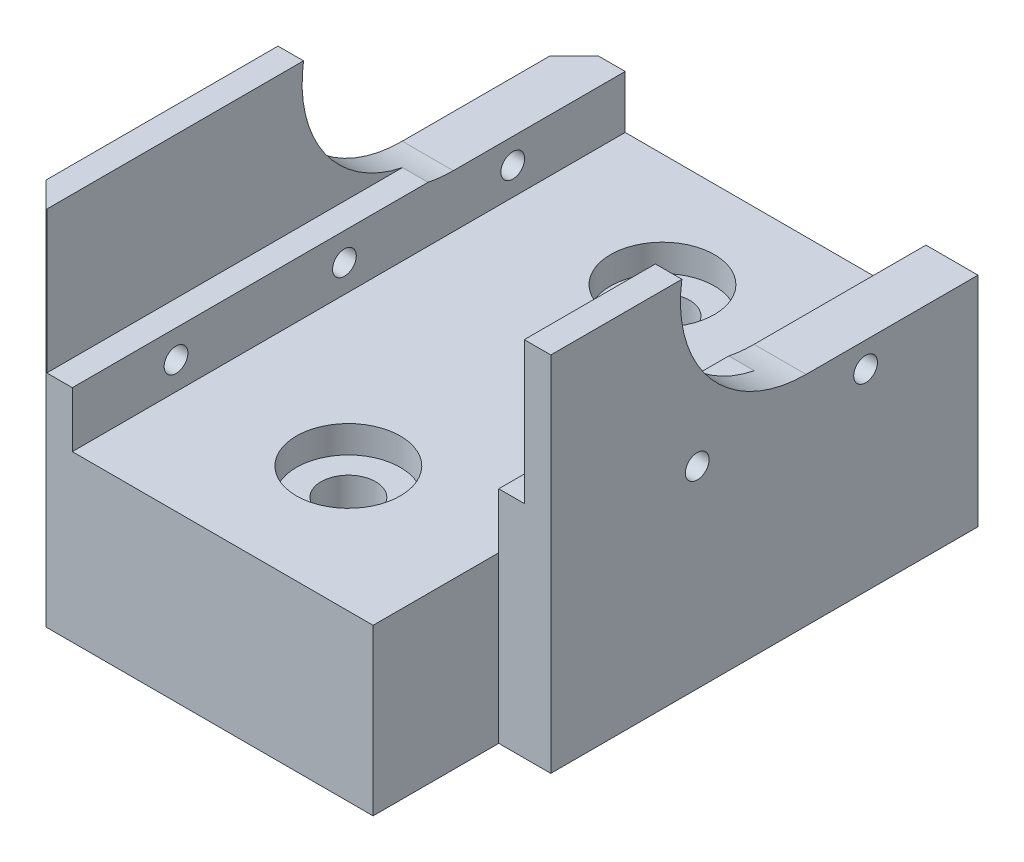
ISO-10303-21;
HEADER;
FILE_DESCRIPTION(('STEP AP214'),'2;1');
FILE_NAME('part.step','',(''),(''),'','','');
FILE_SCHEMA(('AUTOMOTIVE_DESIGN { 1 0 10303 214 1 1 1 1 }'));
ENDSEC;
DATA;
#1=APPLICATION_CONTEXT('core data for automotive mechanical design processes');
#2=APPLICATION_PROTOCOL_DEFINITION('international standard','automotive_design',2000,#1);
#3=PRODUCT_CONTEXT('',#1,'mechanical');
#4=PRODUCT('Part','Part','',(#3));
#5=PRODUCT_RELATED_PRODUCT_CATEGORY('part','',(#4));
#6=PRODUCT_DEFINITION_FORMATION('','',#4);
#7=PRODUCT_DEFINITION_CONTEXT('part definition',#1,'design');
#8=PRODUCT_DEFINITION('design','',#6,#7);
#9=PRODUCT_DEFINITION_SHAPE('','',#8);
#10=(LENGTH_UNIT() NAMED_UNIT(*) SI_UNIT(.MILLI.,.METRE.));
#11=(NAMED_UNIT(*) PLANE_ANGLE_UNIT() SI_UNIT($,.RADIAN.));
#12=(NAMED_UNIT(*) SI_UNIT($,.STERADIAN.) SOLID_ANGLE_UNIT());
#13=UNCERTAINTY_MEASURE_WITH_UNIT(LENGTH_MEASURE(1.E-05),#10,'distance_accuracy_value','');
#14=(GEOMETRIC_REPRESENTATION_CONTEXT(3) GLOBAL_UNCERTAINTY_ASSIGNED_CONTEXT((#13)) GLOBAL_UNIT_ASSIGNED_CONTEXT((#10,
#11,#12)) REPRESENTATION_CONTEXT('',''));
#15=CARTESIAN_POINT('',(0.,0.,0.));
#16=DIRECTION('',(0.,0.,1.));
#17=DIRECTION('',(1.,0.,0.));
#18=AXIS2_PLACEMENT_3D('',#15,#16,#17);
#19=CARTESIAN_POINT('',(15.1999954,27.305,-30.48));
#20=DIRECTION('',(1.,0.,0.));
#21=DIRECTION('',(0.,0.,-1.));
#22=AXIS2_PLACEMENT_3D('',#19,#20,#21);
#23=PLANE('',#22);
#24=CARTESIAN_POINT('',(15.1999954,10.16,-19.1188086));
#25=DIRECTION('',(1.,0.,0.));
#26=DIRECTION('',(0.,0.,-1.));
#27=AXIS2_PLACEMENT_3D('',#24,#25,#26);
#28=CIRCLE('',#27,1.19999999999999);
#29=CARTESIAN_POINT('',(15.1999954,10.16,-20.3188086));
#30=VERTEX_POINT('',#29);
#31=EDGE_CURVE('E255',#30,#30,#28,.T.);
#32=ORIENTED_EDGE('',*,*,#31,.T.);
#33=EDGE_LOOP('',(#32));
#34=FACE_BOUND('',#33,.T.);
#35=CARTESIAN_POINT('',(15.1999954,10.16,-2.1008086));
#36=DIRECTION('',(1.,0.,0.));
#37=DIRECTION('',(0.,0.,-1.));
#38=AXIS2_PLACEMENT_3D('',#35,#36,#37);
#39=CIRCLE('',#38,1.19999999999999);
#40=CARTESIAN_POINT('',(15.1999954,10.16,-3.3008086));
#41=VERTEX_POINT('',#40);
#42=EDGE_CURVE('E245',#41,#41,#39,.T.);
#43=ORIENTED_EDGE('',*,*,#42,.T.);
#44=EDGE_LOOP('',(#43));
#45=FACE_BOUND('',#44,.T.);
#46=DIRECTION('',(0.,-1.,0.));
#47=VECTOR('',#46,1.);
#48=CARTESIAN_POINT('',(15.1999954,-9.325,12.7000000000002));
#49=LINE('',#48,#47);
#50=CARTESIAN_POINT('',(15.1999954,12.9600198000048,12.7000000000002));
#51=VERTEX_POINT('',#50);
#52=CARTESIAN_POINT('',(15.1999954,7.3600056,12.7000000000002));
#53=VERTEX_POINT('',#52);
#54=EDGE_CURVE('E362',#51,#53,#49,.T.);
#55=ORIENTED_EDGE('',*,*,#54,.F.);
#56=DIRECTION('',(0.,0.,-1.));
#57=VECTOR('',#56,1.);
#58=CARTESIAN_POINT('',(15.1999954,12.9600198000048,-30.48));
#59=LINE('',#58,#57);
#60=CARTESIAN_POINT('',(15.1999954,12.9600198000048,-10.5482652898117));
#61=VERTEX_POINT('',#60);
#62=EDGE_CURVE('E263',#51,#61,#59,.T.);
#63=ORIENTED_EDGE('',*,*,#62,.T.);
#64=CARTESIAN_POINT('',(15.1999954,25.4,-13.105000048));
#65=DIRECTION('',(1.,0.,0.));
#66=DIRECTION('',(0.,0.,-1.));
#67=AXIS2_PLACEMENT_3D('',#64,#65,#66);
#68=CIRCLE('',#67,12.7);
#69=CARTESIAN_POINT('',(15.1999954,12.7,-13.105000048));
#70=VERTEX_POINT('',#69);
#71=EDGE_CURVE('E221',#61,#70,#68,.T.);
#72=ORIENTED_EDGE('',*,*,#71,.T.);
#73=DIRECTION('',(0.,0.,-1.));
#74=VECTOR('',#73,1.);
#75=CARTESIAN_POINT('',(15.1999954,12.7,-30.48));
#76=LINE('',#75,#74);
#77=CARTESIAN_POINT('',(15.1999954,12.7,-30.48));
#78=VERTEX_POINT('',#77);
#79=EDGE_CURVE('E267',#70,#78,#76,.T.);
#80=ORIENTED_EDGE('',*,*,#79,.T.);
#81=DIRECTION('',(0.,-1.,0.));
#82=VECTOR('',#81,1.);
#83=CARTESIAN_POINT('',(15.1999954,27.305,-30.48));
#84=LINE('',#83,#82);
#85=CARTESIAN_POINT('',(15.1999954,7.3600056,-30.48));
#86=VERTEX_POINT('',#85);
#87=EDGE_CURVE('E249',#78,#86,#84,.T.);
#88=ORIENTED_EDGE('',*,*,#87,.T.);
#89=DIRECTION('',(0.,0.,-1.));
#90=VECTOR('',#89,1.);
#91=CARTESIAN_POINT('',(15.1999954,7.3600056,30.4800000000251));
#92=LINE('',#91,#90);
#93=EDGE_CURVE('E313',#53,#86,#92,.T.);
#94=ORIENTED_EDGE('',*,*,#93,.F.);
#95=EDGE_LOOP('',(#55,#63,#72,#80,#88,#94));
#96=FACE_BOUND('',#95,.T.);
#97=ADVANCED_FACE('F41',(#34,#45,#96),#23,.F.);
#98=CARTESIAN_POINT('',(0.,27.305,0.));
#99=DIRECTION('',(0.,1.,0.));
#100=DIRECTION('',(0.,0.,1.));
#101=AXIS2_PLACEMENT_3D('',#98,#99,#100);
#102=PLANE('',#101);
#103=DIRECTION('',(0.,0.,1.));
#104=VECTOR('',#103,1.);
#105=CARTESIAN_POINT('',(20.4599999740001,27.305,-30.48));
#106=LINE('',#105,#104);
#107=CARTESIAN_POINT('',(20.4599999740001,27.305,-0.548687890363903));
#108=VERTEX_POINT('',#107);
#109=CARTESIAN_POINT('',(20.4599999740001,27.3050000000126,12.7000000000002));
#110=VERTEX_POINT('',#109);
#111=EDGE_CURVE('E382',#108,#110,#106,.T.);
#112=ORIENTED_EDGE('',*,*,#111,.F.);
#113=DIRECTION('',(1.,0.,0.));
#114=VECTOR('',#113,1.);
#115=CARTESIAN_POINT('',(-22.86,27.305,-0.548687890363903));
#116=LINE('',#115,#114);
#117=CARTESIAN_POINT('',(17.78,27.3050000000126,-0.548687890365808));
#118=VERTEX_POINT('',#117);
#119=EDGE_CURVE('E224',#118,#108,#116,.T.);
#120=ORIENTED_EDGE('',*,*,#119,.F.);
#121=DIRECTION('',(0.,0.,-1.));
#122=VECTOR('',#121,1.);
#123=CARTESIAN_POINT('',(17.78,27.3050000000126,400000.));
#124=LINE('',#123,#122);
#125=CARTESIAN_POINT('',(17.78,27.3050000000126,12.7000000000002));
#126=VERTEX_POINT('',#125);
#127=EDGE_CURVE('E230',#126,#118,#124,.T.);
#128=ORIENTED_EDGE('',*,*,#127,.F.);
#129=DIRECTION('',(-1.,0.,0.));
#130=VECTOR('',#129,1.);
#131=CARTESIAN_POINT('',(15.1999954,27.3050000000126,12.7000000000002));
#132=LINE('',#131,#130);
#133=EDGE_CURVE('E365',#110,#126,#132,.T.);
#134=ORIENTED_EDGE('',*,*,#133,.F.);
#135=EDGE_LOOP('',(#112,#120,#128,#134));
#136=FACE_BOUND('',#135,.T.);
#137=ADVANCED_FACE('F430',(#136),#102,.T.);
#138=CARTESIAN_POINT('',(17.78,0.,0.));
#139=DIRECTION('',(-1.,0.,0.));
#140=DIRECTION('',(0.,0.,1.));
#141=AXIS2_PLACEMENT_3D('',#138,#139,#140);
#142=PLANE('',#141);
#143=DIRECTION('',(0.,0.,1.));
#144=VECTOR('',#143,1.);
#145=CARTESIAN_POINT('',(17.78,12.9600198000048,400000.));
#146=LINE('',#145,#144);
#147=CARTESIAN_POINT('',(17.78,12.9600198000048,-10.5482652898117));
#148=VERTEX_POINT('',#147);
#149=CARTESIAN_POINT('',(17.78,12.9600198000048,12.6999999999953));
#150=VERTEX_POINT('',#149);
#151=EDGE_CURVE('E232',#148,#150,#146,.T.);
#152=ORIENTED_EDGE('',*,*,#151,.T.);
#153=DIRECTION('',(0.,1.,0.));
#154=VECTOR('',#153,1.);
#155=CARTESIAN_POINT('',(17.78,0.,12.7000000000002));
#156=LINE('',#155,#154);
#157=EDGE_CURVE('E354',#150,#126,#156,.T.);
#158=ORIENTED_EDGE('',*,*,#157,.T.);
#159=ORIENTED_EDGE('',*,*,#127,.T.);
#160=CARTESIAN_POINT('',(17.78,25.4,-13.105000048));
#161=DIRECTION('',(-1.,0.,0.));
#162=DIRECTION('',(0.,0.,1.));
#163=AXIS2_PLACEMENT_3D('',#160,#161,#162);
#164=CIRCLE('',#163,12.7);
#165=EDGE_CURVE('E218',#148,#118,#164,.T.);
#166=ORIENTED_EDGE('',*,*,#165,.F.);
#167=EDGE_LOOP('',(#152,#158,#159,#166));
#168=FACE_BOUND('',#167,.T.);
#169=ADVANCED_FACE('F436',(#168),#142,.T.);
#170=CARTESIAN_POINT('',(17.78,12.9600198000048,400000.));
#171=DIRECTION('',(0.,-1.,0.));
#172=DIRECTION('',(0.,0.,-1.));
#173=AXIS2_PLACEMENT_3D('',#170,#171,#172);
#174=PLANE('',#173);
#175=DIRECTION('',(-1.,0.,0.));
#176=VECTOR('',#175,1.);
#177=CARTESIAN_POINT('',(17.78,12.9600198000048,12.6999999999953));
#178=LINE('',#177,#176);
#179=EDGE_CURVE('E357',#150,#51,#178,.T.);
#180=ORIENTED_EDGE('',*,*,#179,.F.);
#181=ORIENTED_EDGE('',*,*,#151,.F.);
#182=DIRECTION('',(1.,0.,0.));
#183=VECTOR('',#182,1.);
#184=CARTESIAN_POINT('',(-22.86,12.9600198000048,-10.5482652898117));
#185=LINE('',#184,#183);
#186=EDGE_CURVE('E209',#148,#61,#185,.F.);
#187=ORIENTED_EDGE('',*,*,#186,.T.);
#188=ORIENTED_EDGE('',*,*,#62,.F.);
#189=EDGE_LOOP('',(#180,#181,#187,#188));
#190=FACE_BOUND('',#189,.T.);
#191=ADVANCED_FACE('F440',(#190),#174,.F.);
#192=CARTESIAN_POINT('',(-15.1999954,27.305,-30.48));
#193=DIRECTION('',(-1.,0.,0.));
#194=DIRECTION('',(0.,0.,1.));
#195=AXIS2_PLACEMENT_3D('',#192,#193,#194);
#196=PLANE('',#195);
#197=CARTESIAN_POINT('',(-15.1999954,10.16,-2.1008086));
#198=DIRECTION('',(-1.,0.,0.));
#199=DIRECTION('',(0.,0.,1.));
#200=AXIS2_PLACEMENT_3D('',#197,#198,#199);
#201=CIRCLE('',#200,1.19999999999999);
#202=CARTESIAN_POINT('',(-15.1999954,10.16,-0.900808600000012));
#203=VERTEX_POINT('',#202);
#204=EDGE_CURVE('E242',#203,#203,#201,.T.);
#205=ORIENTED_EDGE('',*,*,#204,.T.);
#206=EDGE_LOOP('',(#205));
#207=FACE_BOUND('',#206,.T.);
#208=CARTESIAN_POINT('',(-15.1999954,10.16,14.9171914));
#209=DIRECTION('',(-1.,0.,0.));
#210=DIRECTION('',(0.,0.,1.));
#211=AXIS2_PLACEMENT_3D('',#208,#209,#210);
#212=CIRCLE('',#211,1.19999999999999);
#213=CARTESIAN_POINT('',(-15.1999954,10.16,16.1171914));
#214=VERTEX_POINT('',#213);
#215=EDGE_CURVE('E248',#214,#214,#212,.T.);
#216=ORIENTED_EDGE('',*,*,#215,.T.);
#217=EDGE_LOOP('',(#216));
#218=FACE_BOUND('',#217,.T.);
#219=CARTESIAN_POINT('',(-15.1999954,10.16,-19.1188086));
#220=DIRECTION('',(-1.,0.,0.));
#221=DIRECTION('',(0.,0.,1.));
#222=AXIS2_PLACEMENT_3D('',#219,#220,#221);
#223=CIRCLE('',#222,1.19999999999999);
#224=CARTESIAN_POINT('',(-15.1999954,10.16,-17.9188086));
#225=VERTEX_POINT('',#224);
#226=EDGE_CURVE('E260',#225,#225,#223,.T.);
#227=ORIENTED_EDGE('',*,*,#226,.T.);
#228=EDGE_LOOP('',(#227));
#229=FACE_BOUND('',#228,.T.);
#230=DIRECTION('',(0.,1.,0.));
#231=VECTOR('',#230,1.);
#232=CARTESIAN_POINT('',(-15.1999954,27.305,25.4000000000001));
#233=LINE('',#232,#231);
#234=CARTESIAN_POINT('',(-15.1999954,7.3600056,25.4000000000001));
#235=VERTEX_POINT('',#234);
#236=CARTESIAN_POINT('',(-15.1999954,12.9600198000048,25.4000000000001));
#237=VERTEX_POINT('',#236);
#238=EDGE_CURVE('E349',#235,#237,#233,.T.);
#239=ORIENTED_EDGE('',*,*,#238,.F.);
#240=DIRECTION('',(0.,0.,1.));
#241=VECTOR('',#240,1.);
#242=CARTESIAN_POINT('',(-15.1999954,7.3600056,30.4800000000251));
#243=LINE('',#242,#241);
#244=CARTESIAN_POINT('',(-15.1999954,7.3600056,-30.48));
#245=VERTEX_POINT('',#244);
#246=EDGE_CURVE('E316',#245,#235,#243,.T.);
#247=ORIENTED_EDGE('',*,*,#246,.F.);
#248=DIRECTION('',(0.,-1.,0.));
#249=VECTOR('',#248,1.);
#250=CARTESIAN_POINT('',(-15.1999954,27.305,-30.48));
#251=LINE('',#250,#249);
#252=CARTESIAN_POINT('',(-15.1999954,12.7,-30.48));
#253=VERTEX_POINT('',#252);
#254=EDGE_CURVE('E252',#253,#245,#251,.T.);
#255=ORIENTED_EDGE('',*,*,#254,.F.);
#256=DIRECTION('',(0.,0.,1.));
#257=VECTOR('',#256,1.);
#258=CARTESIAN_POINT('',(-15.1999954,12.7,-30.48));
#259=LINE('',#258,#257);
#260=CARTESIAN_POINT('',(-15.1999954,12.7,-13.105000048));
#261=VERTEX_POINT('',#260);
#262=EDGE_CURVE('E227',#253,#261,#259,.T.);
#263=ORIENTED_EDGE('',*,*,#262,.T.);
#264=CARTESIAN_POINT('',(-15.1999954,25.4,-13.105000048));
#265=DIRECTION('',(-1.,0.,0.));
#266=DIRECTION('',(0.,0.,1.));
#267=AXIS2_PLACEMENT_3D('',#264,#265,#266);
#268=CIRCLE('',#267,12.7);
#269=CARTESIAN_POINT('',(-15.1999954,12.9600198000048,-10.5482652898117));
#270=VERTEX_POINT('',#269);
#271=EDGE_CURVE('E205',#261,#270,#268,.T.);
#272=ORIENTED_EDGE('',*,*,#271,.T.);
#273=DIRECTION('',(0.,0.,1.));
#274=VECTOR('',#273,1.);
#275=CARTESIAN_POINT('',(-15.1999954,12.9600198000048,-30.48));
#276=LINE('',#275,#274);
#277=EDGE_CURVE('E236',#270,#237,#276,.T.);
#278=ORIENTED_EDGE('',*,*,#277,.T.);
#279=EDGE_LOOP('',(#239,#247,#255,#263,#272,#278));
#280=FACE_BOUND('',#279,.T.);
#281=ADVANCED_FACE('F413',(#207,#218,#229,#280),#196,.F.);
#282=CARTESIAN_POINT('',(0.,27.305,0.));
#283=DIRECTION('',(0.,1.,0.));
#284=DIRECTION('',(0.,0.,1.));
#285=AXIS2_PLACEMENT_3D('',#282,#283,#284);
#286=PLANE('',#285);
#287=DIRECTION('',(0.,0.,1.));
#288=VECTOR('',#287,1.);
#289=CARTESIAN_POINT('',(-20.3599999999999,27.3050000000126,-30.48));
#290=LINE('',#289,#288);
#291=CARTESIAN_POINT('',(-20.3599999999999,27.3050000000126,-0.548687890365808));
#292=VERTEX_POINT('',#291);
#293=CARTESIAN_POINT('',(-20.3599999999999,27.3050000000126,22.9000000000002));
#294=VERTEX_POINT('',#293);
#295=EDGE_CURVE('E177',#292,#294,#290,.T.);
#296=ORIENTED_EDGE('',*,*,#295,.T.);
#297=DIRECTION('',(0.707106781186543,0.,0.707106781186552));
#298=VECTOR('',#297,1.);
#299=CARTESIAN_POINT('',(-21.6300000000002,27.305,21.6299999999999));
#300=LINE('',#299,#298);
#301=CARTESIAN_POINT('',(-17.8600000000002,27.3050000000126,25.4));
#302=VERTEX_POINT('',#301);
#303=EDGE_CURVE('E279',#294,#302,#300,.T.);
#304=ORIENTED_EDGE('',*,*,#303,.T.);
#305=DIRECTION('',(-1.,0.,0.));
#306=VECTOR('',#305,1.);
#307=CARTESIAN_POINT('',(-22.8599999999999,27.3050000000126,25.4));
#308=LINE('',#307,#306);
#309=CARTESIAN_POINT('',(-17.78,27.3050000000126,25.4));
#310=VERTEX_POINT('',#309);
#311=EDGE_CURVE('E351',#310,#302,#308,.T.);
#312=ORIENTED_EDGE('',*,*,#311,.F.);
#313=DIRECTION('',(0.,0.,-1.));
#314=VECTOR('',#313,1.);
#315=CARTESIAN_POINT('',(-17.78,27.3050000000126,400000.));
#316=LINE('',#315,#314);
#317=CARTESIAN_POINT('',(-17.78,27.3050000000126,-0.548687890365808));
#318=VERTEX_POINT('',#317);
#319=EDGE_CURVE('E203',#310,#318,#316,.T.);
#320=ORIENTED_EDGE('',*,*,#319,.T.);
#321=DIRECTION('',(1.,0.,0.));
#322=VECTOR('',#321,1.);
#323=CARTESIAN_POINT('',(-22.86,27.305,-0.548687890363903));
#324=LINE('',#323,#322);
#325=EDGE_CURVE('E193',#292,#318,#324,.T.);
#326=ORIENTED_EDGE('',*,*,#325,.F.);
#327=EDGE_LOOP('',(#296,#304,#312,#320,#326));
#328=FACE_BOUND('',#327,.T.);
#329=ADVANCED_FACE('F200',(#328),#286,.T.);
#330=DIRECTION('',(-1.,0.,0.));
#331=VECTOR('',#330,1.);
#332=CARTESIAN_POINT('',(17.7800000041279,12.9600198000048,25.3999999999905));
#333=LINE('',#332,#331);
#334=CARTESIAN_POINT('',(-17.78,12.9600198000048,25.3999999999902));
#335=VERTEX_POINT('',#334);
#336=EDGE_CURVE('E347',#237,#335,#333,.T.);
#337=ORIENTED_EDGE('',*,*,#336,.F.);
#338=ORIENTED_EDGE('',*,*,#277,.F.);
#339=DIRECTION('',(1.,0.,0.));
#340=VECTOR('',#339,1.);
#341=CARTESIAN_POINT('',(-22.86,12.9600198000048,-10.5482652898117));
#342=LINE('',#341,#340);
#343=CARTESIAN_POINT('',(-17.78,12.9600198000048,-10.5482652898117));
#344=VERTEX_POINT('',#343);
#345=EDGE_CURVE('E206',#270,#344,#342,.F.);
#346=ORIENTED_EDGE('',*,*,#345,.T.);
#347=DIRECTION('',(0.,0.,1.));
#348=VECTOR('',#347,1.);
#349=CARTESIAN_POINT('',(-17.78,12.9600198000048,400000.));
#350=LINE('',#349,#348);
#351=EDGE_CURVE('E233',#344,#335,#350,.T.);
#352=ORIENTED_EDGE('',*,*,#351,.T.);
#353=EDGE_LOOP('',(#337,#338,#346,#352));
#354=FACE_BOUND('',#353,.T.);
#355=ADVANCED_FACE('F409',(#354),#174,.F.);
#356=CARTESIAN_POINT('',(-17.78,0.,0.));
#357=DIRECTION('',(-1.,0.,0.));
#358=DIRECTION('',(0.,0.,1.));
#359=AXIS2_PLACEMENT_3D('',#356,#357,#358);
#360=PLANE('',#359);
#361=DIRECTION('',(0.,1.,0.));
#362=VECTOR('',#361,1.);
#363=CARTESIAN_POINT('',(-17.78,0.,25.4));
#364=LINE('',#363,#362);
#365=EDGE_CURVE('E345',#335,#310,#364,.T.);
#366=ORIENTED_EDGE('',*,*,#365,.F.);
#367=ORIENTED_EDGE('',*,*,#351,.F.);
#368=CARTESIAN_POINT('',(-17.78,25.4,-13.105000048));
#369=DIRECTION('',(-1.,0.,0.));
#370=DIRECTION('',(0.,0.,1.));
#371=AXIS2_PLACEMENT_3D('',#368,#369,#370);
#372=CIRCLE('',#371,12.7);
#373=EDGE_CURVE('E265',#344,#318,#372,.T.);
#374=ORIENTED_EDGE('',*,*,#373,.T.);
#375=ORIENTED_EDGE('',*,*,#319,.F.);
#376=EDGE_LOOP('',(#366,#367,#374,#375));
#377=FACE_BOUND('',#376,.T.);
#378=ADVANCED_FACE('F407',(#377),#360,.F.);
#379=CARTESIAN_POINT('',(0.,-9.325,0.));
#380=DIRECTION('',(0.,-1.,0.));
#381=DIRECTION('',(0.,0.,-1.));
#382=AXIS2_PLACEMENT_3D('',#379,#380,#381);
#383=PLANE('',#382);
#384=DIRECTION('',(-1.,0.,0.));
#385=VECTOR('',#384,1.);
#386=CARTESIAN_POINT('',(-2.62135991925387E-13,-9.325,25.4000000000002));
#387=LINE('',#386,#385);
#388=CARTESIAN_POINT('',(15.1999954,-9.325,25.4000000000002));
#389=VERTEX_POINT('',#388);
#390=CARTESIAN_POINT('',(-17.8600000000002,-9.325,25.4));
#391=VERTEX_POINT('',#390);
#392=EDGE_CURVE('E342',#389,#391,#387,.T.);
#393=ORIENTED_EDGE('',*,*,#392,.T.);
#394=DIRECTION('',(-0.707106781186543,0.,-0.707106781186552));
#395=VECTOR('',#394,1.);
#396=CARTESIAN_POINT('',(-21.6300000000002,-9.325,21.6299999999999));
#397=LINE('',#396,#395);
#398=CARTESIAN_POINT('',(-20.3599999999999,-9.325,22.9000000000002));
#399=VERTEX_POINT('',#398);
#400=EDGE_CURVE('E284',#391,#399,#397,.T.);
#401=ORIENTED_EDGE('',*,*,#400,.T.);
#402=DIRECTION('',(0.,0.,1.));
#403=VECTOR('',#402,1.);
#404=CARTESIAN_POINT('',(-20.3599999999999,-9.325,-30.48));
#405=LINE('',#404,#403);
#406=CARTESIAN_POINT('',(-20.3599999999999,-9.325,-27.98));
#407=VERTEX_POINT('',#406);
#408=EDGE_CURVE('E189',#407,#399,#405,.T.);
#409=ORIENTED_EDGE('',*,*,#408,.F.);
#410=DIRECTION('',(-0.707106781186547,0.,0.707106781186548));
#411=VECTOR('',#410,1.);
#412=CARTESIAN_POINT('',(-24.17,-9.325,-24.1699999999999));
#413=LINE('',#412,#411);
#414=CARTESIAN_POINT('',(-17.86,-9.325,-30.48));
#415=VERTEX_POINT('',#414);
#416=EDGE_CURVE('E63',#407,#415,#413,.F.);
#417=ORIENTED_EDGE('',*,*,#416,.T.);
#418=DIRECTION('',(1.,0.,0.));
#419=VECTOR('',#418,1.);
#420=CARTESIAN_POINT('',(-22.86,-9.325,-30.48));
#421=LINE('',#420,#419);
#422=CARTESIAN_POINT('',(20.4599999740001,-9.325,-30.48));
#423=VERTEX_POINT('',#422);
#424=EDGE_CURVE('E290',#415,#423,#421,.T.);
#425=ORIENTED_EDGE('',*,*,#424,.T.);
#426=DIRECTION('',(0.,0.,1.));
#427=VECTOR('',#426,1.);
#428=CARTESIAN_POINT('',(20.4599999740001,-9.325,-30.48));
#429=LINE('',#428,#427);
#430=CARTESIAN_POINT('',(20.4599999740001,-9.325,12.7000000000002));
#431=VERTEX_POINT('',#430);
#432=EDGE_CURVE('E381',#423,#431,#429,.T.);
#433=ORIENTED_EDGE('',*,*,#432,.T.);
#434=DIRECTION('',(1.,0.,0.));
#435=VECTOR('',#434,1.);
#436=CARTESIAN_POINT('',(15.1999954,-9.325,12.7000000000002));
#437=LINE('',#436,#435);
#438=CARTESIAN_POINT('',(15.1999954,-9.325,12.7000000000002));
#439=VERTEX_POINT('',#438);
#440=EDGE_CURVE('E367',#439,#431,#437,.T.);
#441=ORIENTED_EDGE('',*,*,#440,.F.);
#442=DIRECTION('',(0.,0.,1.));
#443=VECTOR('',#442,1.);
#444=CARTESIAN_POINT('',(15.1999954,-9.325,12.7000000000002));
#445=LINE('',#444,#443);
#446=EDGE_CURVE('E359',#439,#389,#445,.T.);
#447=ORIENTED_EDGE('',*,*,#446,.T.);
#448=EDGE_LOOP('',(#393,#401,#409,#417,#425,#433,#441,#447));
#449=FACE_BOUND('',#448,.T.);
#450=CARTESIAN_POINT('',(0.,-9.325,12.7));
#451=DIRECTION('',(0.,1.,0.));
#452=DIRECTION('',(0.,0.,1.));
#453=AXIS2_PLACEMENT_3D('',#450,#451,#452);
#454=CIRCLE('',#453,2.75);
#455=CARTESIAN_POINT('',(0.,-9.325,15.45));
#456=VERTEX_POINT('',#455);
#457=EDGE_CURVE('E330',#456,#456,#454,.T.);
#458=ORIENTED_EDGE('',*,*,#457,.T.);
#459=EDGE_LOOP('',(#458));
#460=FACE_BOUND('',#459,.T.);
#461=CARTESIAN_POINT('',(0.,-9.325,-19.05));
#462=DIRECTION('',(0.,1.,0.));
#463=DIRECTION('',(0.,0.,1.));
#464=AXIS2_PLACEMENT_3D('',#461,#462,#463);
#465=CIRCLE('',#464,2.75);
#466=CARTESIAN_POINT('',(0.,-9.325,-16.3));
#467=VERTEX_POINT('',#466);
#468=EDGE_CURVE('E318',#467,#467,#465,.T.);
#469=ORIENTED_EDGE('',*,*,#468,.T.);
#470=EDGE_LOOP('',(#469));
#471=FACE_BOUND('',#470,.T.);
#472=ADVANCED_FACE('F448',(#449,#460,#471),#383,.T.);
#473=CARTESIAN_POINT('',(0.,7.3600056,0.));
#474=DIRECTION('',(0.,-1.,0.));
#475=DIRECTION('',(0.,0.,-1.));
#476=AXIS2_PLACEMENT_3D('',#473,#474,#475);
#477=PLANE('',#476);
#478=CARTESIAN_POINT('',(0.,7.3600056,-19.05));
#479=DIRECTION('',(0.,1.,0.));
#480=DIRECTION('',(0.,0.,1.));
#481=AXIS2_PLACEMENT_3D('',#478,#479,#480);
#482=CIRCLE('',#481,5.24999999999999);
#483=CARTESIAN_POINT('',(0.,7.3600056,-13.8));
#484=VERTEX_POINT('',#483);
#485=EDGE_CURVE('E327',#484,#484,#482,.T.);
#486=ORIENTED_EDGE('',*,*,#485,.F.);
#487=EDGE_LOOP('',(#486));
#488=FACE_BOUND('',#487,.T.);
#489=CARTESIAN_POINT('',(0.,7.3600056,12.7));
#490=DIRECTION('',(0.,1.,0.));
#491=DIRECTION('',(0.,0.,1.));
#492=AXIS2_PLACEMENT_3D('',#489,#490,#491);
#493=CIRCLE('',#492,5.24999999999999);
#494=CARTESIAN_POINT('',(0.,7.3600056,17.95));
#495=VERTEX_POINT('',#494);
#496=EDGE_CURVE('E339',#495,#495,#493,.T.);
#497=ORIENTED_EDGE('',*,*,#496,.F.);
#498=EDGE_LOOP('',(#497));
#499=FACE_BOUND('',#498,.T.);
#500=DIRECTION('',(-1.,0.,0.));
#501=VECTOR('',#500,1.);
#502=CARTESIAN_POINT('',(-2.62135991925387E-13,7.3600056,25.4000000000002));
#503=LINE('',#502,#501);
#504=CARTESIAN_POINT('',(15.1999954,7.3600056,25.4000000000002));
#505=VERTEX_POINT('',#504);
#506=EDGE_CURVE('E270',#505,#235,#503,.T.);
#507=ORIENTED_EDGE('',*,*,#506,.F.);
#508=EDGE_CURVE('E308',#505,#53,#92,.T.);
#509=ORIENTED_EDGE('',*,*,#508,.T.);
#510=ORIENTED_EDGE('',*,*,#93,.T.);
#511=DIRECTION('',(-1.,0.,0.));
#512=VECTOR('',#511,1.);
#513=CARTESIAN_POINT('',(-15.1999954,7.3600056,-30.48));
#514=LINE('',#513,#512);
#515=EDGE_CURVE('E304',#86,#245,#514,.T.);
#516=ORIENTED_EDGE('',*,*,#515,.T.);
#517=ORIENTED_EDGE('',*,*,#246,.T.);
#518=EDGE_LOOP('',(#507,#509,#510,#516,#517));
#519=FACE_BOUND('',#518,.T.);
#520=ADVANCED_FACE('F451',(#488,#499,#519),#477,.F.);
#521=CARTESIAN_POINT('',(22.86,10.16,-19.1188086));
#522=DIRECTION('',(1.,0.,0.));
#523=DIRECTION('',(0.,0.,-1.));
#524=AXIS2_PLACEMENT_3D('',#521,#522,#523);
#525=CYLINDRICAL_SURFACE('',#524,1.19999999999999);
#526=CARTESIAN_POINT('',(-20.3599999999999,10.16,-19.1188086));
#527=DIRECTION('',(1.,0.,0.));
#528=DIRECTION('',(0.,1.,0.));
#529=AXIS2_PLACEMENT_3D('',#526,#527,#528);
#530=CIRCLE('',#529,1.19999999999999);
#531=CARTESIAN_POINT('',(-20.3599999999999,11.36,-19.1188086));
#532=VERTEX_POINT('',#531);
#533=EDGE_CURVE('E387',#532,#532,#530,.F.);
#534=ORIENTED_EDGE('',*,*,#533,.T.);
#535=EDGE_LOOP('',(#534));
#536=FACE_BOUND('',#535,.T.);
#537=ORIENTED_EDGE('',*,*,#226,.F.);
#538=EDGE_LOOP('',(#537));
#539=FACE_BOUND('',#538,.T.);
#540=ADVANCED_FACE('F478',(#536,#539),#525,.F.);
#541=CARTESIAN_POINT('',(22.86,10.16,-19.1188086));
#542=DIRECTION('',(1.,0.,0.));
#543=DIRECTION('',(0.,0.,-1.));
#544=AXIS2_PLACEMENT_3D('',#541,#542,#543);
#545=CYLINDRICAL_SURFACE('',#544,1.19999999999999);
#546=CARTESIAN_POINT('',(20.4599999740001,10.16,-19.1188086));
#547=DIRECTION('',(-1.,0.,0.));
#548=DIRECTION('',(0.,-1.,0.));
#549=AXIS2_PLACEMENT_3D('',#546,#547,#548);
#550=CIRCLE('',#549,1.19999999999999);
#551=CARTESIAN_POINT('',(20.4599999740001,8.96000000000001,-19.1188086));
#552=VERTEX_POINT('',#551);
#553=EDGE_CURVE('E370',#552,#552,#550,.F.);
#554=ORIENTED_EDGE('',*,*,#553,.T.);
#555=EDGE_LOOP('',(#554));
#556=FACE_BOUND('',#555,.T.);
#557=ORIENTED_EDGE('',*,*,#31,.F.);
#558=EDGE_LOOP('',(#557));
#559=FACE_BOUND('',#558,.T.);
#560=ADVANCED_FACE('F515',(#556,#559),#545,.F.);
#561=CARTESIAN_POINT('',(-22.86,6.35,-30.48));
#562=DIRECTION('',(0.,0.,1.));
#563=DIRECTION('',(1.,0.,0.));
#564=AXIS2_PLACEMENT_3D('',#561,#562,#563);
#565=PLANE('',#564);
#566=ORIENTED_EDGE('',*,*,#424,.F.);
#567=DIRECTION('',(0.,1.,0.));
#568=VECTOR('',#567,1.);
#569=CARTESIAN_POINT('',(-17.86,6.35,-30.48));
#570=LINE('',#569,#568);
#571=CARTESIAN_POINT('',(-17.86,12.7,-30.48));
#572=VERTEX_POINT('',#571);
#573=EDGE_CURVE('E50',#415,#572,#570,.T.);
#574=ORIENTED_EDGE('',*,*,#573,.T.);
#575=DIRECTION('',(1.,0.,0.));
#576=VECTOR('',#575,1.);
#577=CARTESIAN_POINT('',(-22.86,12.7,-30.48));
#578=LINE('',#577,#576);
#579=EDGE_CURVE('E212',#572,#253,#578,.T.);
#580=ORIENTED_EDGE('',*,*,#579,.T.);
#581=ORIENTED_EDGE('',*,*,#254,.T.);
#582=ORIENTED_EDGE('',*,*,#515,.F.);
#583=ORIENTED_EDGE('',*,*,#87,.F.);
#584=CARTESIAN_POINT('',(20.4599999740001,12.7,-30.48));
#585=VERTEX_POINT('',#584);
#586=EDGE_CURVE('E294',#78,#585,#578,.T.);
#587=ORIENTED_EDGE('',*,*,#586,.T.);
#588=DIRECTION('',(0.,-1.,0.));
#589=VECTOR('',#588,1.);
#590=CARTESIAN_POINT('',(20.4599999740001,27.305,-30.48));
#591=LINE('',#590,#589);
#592=EDGE_CURVE('E384',#585,#423,#591,.T.);
#593=ORIENTED_EDGE('',*,*,#592,.T.);
#594=EDGE_LOOP('',(#566,#574,#580,#581,#582,#583,#587,#593));
#595=FACE_BOUND('',#594,.T.);
#596=ADVANCED_FACE('F287',(#595),#565,.F.);
#597=CARTESIAN_POINT('',(22.86,10.16,14.9171914));
#598=DIRECTION('',(1.,0.,0.));
#599=DIRECTION('',(0.,0.,-1.));
#600=AXIS2_PLACEMENT_3D('',#597,#598,#599);
#601=CYLINDRICAL_SURFACE('',#600,1.19999999999999);
#602=CARTESIAN_POINT('',(-20.3599999999999,10.16,14.9171914));
#603=DIRECTION('',(1.,0.,0.));
#604=DIRECTION('',(0.,1.,0.));
#605=AXIS2_PLACEMENT_3D('',#602,#603,#604);
#606=CIRCLE('',#605,1.19999999999999);
#607=CARTESIAN_POINT('',(-20.3599999999999,11.36,14.9171914));
#608=VERTEX_POINT('',#607);
#609=EDGE_CURVE('E390',#608,#608,#606,.F.);
#610=ORIENTED_EDGE('',*,*,#609,.T.);
#611=EDGE_LOOP('',(#610));
#612=FACE_BOUND('',#611,.T.);
#613=ORIENTED_EDGE('',*,*,#215,.F.);
#614=EDGE_LOOP('',(#613));
#615=FACE_BOUND('',#614,.T.);
#616=ADVANCED_FACE('F505',(#612,#615),#601,.F.);
#617=CARTESIAN_POINT('',(22.86,10.16,-2.1008086));
#618=DIRECTION('',(1.,0.,0.));
#619=DIRECTION('',(0.,0.,-1.));
#620=AXIS2_PLACEMENT_3D('',#617,#618,#619);
#621=CYLINDRICAL_SURFACE('',#620,1.19999999999999);
#622=CARTESIAN_POINT('',(20.4599999740001,10.16,-2.1008086));
#623=DIRECTION('',(-1.,0.,0.));
#624=DIRECTION('',(0.,-1.,0.));
#625=AXIS2_PLACEMENT_3D('',#622,#623,#624);
#626=CIRCLE('',#625,1.19999999999999);
#627=CARTESIAN_POINT('',(20.4599999740001,8.96000000000001,-2.1008086));
#628=VERTEX_POINT('',#627);
#629=EDGE_CURVE('E373',#628,#628,#626,.F.);
#630=ORIENTED_EDGE('',*,*,#629,.T.);
#631=EDGE_LOOP('',(#630));
#632=FACE_BOUND('',#631,.T.);
#633=ORIENTED_EDGE('',*,*,#42,.F.);
#634=EDGE_LOOP('',(#633));
#635=FACE_BOUND('',#634,.T.);
#636=ADVANCED_FACE('F575',(#632,#635),#621,.F.);
#637=CARTESIAN_POINT('',(22.86,10.16,-2.1008086));
#638=DIRECTION('',(1.,0.,0.));
#639=DIRECTION('',(0.,0.,-1.));
#640=AXIS2_PLACEMENT_3D('',#637,#638,#639);
#641=CYLINDRICAL_SURFACE('',#640,1.19999999999999);
#642=CARTESIAN_POINT('',(-20.3599999999999,10.16,-2.1008086));
#643=DIRECTION('',(1.,0.,0.));
#644=DIRECTION('',(0.,1.,0.));
#645=AXIS2_PLACEMENT_3D('',#642,#643,#644);
#646=CIRCLE('',#645,1.19999999999999);
#647=CARTESIAN_POINT('',(-20.3599999999999,11.36,-2.1008086));
#648=VERTEX_POINT('',#647);
#649=EDGE_CURVE('E197',#648,#648,#646,.F.);
#650=ORIENTED_EDGE('',*,*,#649,.T.);
#651=EDGE_LOOP('',(#650));
#652=FACE_BOUND('',#651,.T.);
#653=ORIENTED_EDGE('',*,*,#204,.F.);
#654=EDGE_LOOP('',(#653));
#655=FACE_BOUND('',#654,.T.);
#656=ADVANCED_FACE('F583',(#652,#655),#641,.F.);
#657=CARTESIAN_POINT('',(-22.86,25.4,-13.105000048));
#658=DIRECTION('',(1.,0.,0.));
#659=DIRECTION('',(0.,0.,-1.));
#660=AXIS2_PLACEMENT_3D('',#657,#658,#659);
#661=CYLINDRICAL_SURFACE('',#660,12.7);
#662=DIRECTION('',(1.,0.,0.));
#663=VECTOR('',#662,1.);
#664=CARTESIAN_POINT('',(-22.86,12.7,-13.105000048));
#665=LINE('',#664,#663);
#666=CARTESIAN_POINT('',(-20.3599999999999,12.7,-13.105000048));
#667=VERTEX_POINT('',#666);
#668=EDGE_CURVE('E196',#667,#261,#665,.T.);
#669=ORIENTED_EDGE('',*,*,#668,.F.);
#670=CARTESIAN_POINT('',(-20.3599999999999,25.4,-13.105000048));
#671=DIRECTION('',(1.,0.,0.));
#672=DIRECTION('',(0.,1.,0.));
#673=AXIS2_PLACEMENT_3D('',#670,#671,#672);
#674=CIRCLE('',#673,12.7);
#675=EDGE_CURVE('E183',#667,#292,#674,.F.);
#676=ORIENTED_EDGE('',*,*,#675,.T.);
#677=ORIENTED_EDGE('',*,*,#325,.T.);
#678=ORIENTED_EDGE('',*,*,#373,.F.);
#679=ORIENTED_EDGE('',*,*,#345,.F.);
#680=ORIENTED_EDGE('',*,*,#271,.F.);
#681=EDGE_LOOP('',(#669,#676,#677,#678,#679,#680));
#682=FACE_BOUND('',#681,.T.);
#683=ADVANCED_FACE('F192',(#682),#661,.F.);
#684=CARTESIAN_POINT('',(-22.86,12.7,-13.105000048));
#685=DIRECTION('',(0.,-1.,0.));
#686=DIRECTION('',(0.,0.,-1.));
#687=AXIS2_PLACEMENT_3D('',#684,#685,#686);
#688=PLANE('',#687);
#689=ORIENTED_EDGE('',*,*,#579,.F.);
#690=DIRECTION('',(0.707106781186547,0.,-0.707106781186548));
#691=VECTOR('',#690,1.);
#692=CARTESIAN_POINT('',(-17.86,12.7,-30.48));
#693=LINE('',#692,#691);
#694=CARTESIAN_POINT('',(-20.3599999999999,12.7,-27.98));
#695=VERTEX_POINT('',#694);
#696=EDGE_CURVE('E12',#572,#695,#693,.F.);
#697=ORIENTED_EDGE('',*,*,#696,.T.);
#698=DIRECTION('',(0.,0.,1.));
#699=VECTOR('',#698,1.);
#700=CARTESIAN_POINT('',(-20.3599999999999,12.7,-13.105000048));
#701=LINE('',#700,#699);
#702=EDGE_CURVE('E198',#695,#667,#701,.T.);
#703=ORIENTED_EDGE('',*,*,#702,.T.);
#704=ORIENTED_EDGE('',*,*,#668,.T.);
#705=ORIENTED_EDGE('',*,*,#262,.F.);
#706=EDGE_LOOP('',(#689,#697,#703,#704,#705));
#707=FACE_BOUND('',#706,.T.);
#708=ADVANCED_FACE('F292',(#707),#688,.F.);
#709=CARTESIAN_POINT('',(20.4599999740001,12.7,-13.105000048));
#710=VERTEX_POINT('',#709);
#711=EDGE_CURVE('E299',#70,#710,#665,.T.);
#712=ORIENTED_EDGE('',*,*,#711,.T.);
#713=DIRECTION('',(0.,0.,-1.));
#714=VECTOR('',#713,1.);
#715=CARTESIAN_POINT('',(20.4599999740001,12.7,-13.105000048));
#716=LINE('',#715,#714);
#717=EDGE_CURVE('E376',#710,#585,#716,.T.);
#718=ORIENTED_EDGE('',*,*,#717,.T.);
#719=ORIENTED_EDGE('',*,*,#586,.F.);
#720=ORIENTED_EDGE('',*,*,#79,.F.);
#721=EDGE_LOOP('',(#712,#718,#719,#720));
#722=FACE_BOUND('',#721,.T.);
#723=ADVANCED_FACE('F419',(#722),#688,.F.);
#724=ORIENTED_EDGE('',*,*,#119,.T.);
#725=CARTESIAN_POINT('',(20.4599999740001,25.4,-13.105000048));
#726=DIRECTION('',(-1.,0.,0.));
#727=DIRECTION('',(0.,-1.,0.));
#728=AXIS2_PLACEMENT_3D('',#725,#726,#727);
#729=CIRCLE('',#728,12.7);
#730=EDGE_CURVE('E378',#108,#710,#729,.F.);
#731=ORIENTED_EDGE('',*,*,#730,.T.);
#732=ORIENTED_EDGE('',*,*,#711,.F.);
#733=ORIENTED_EDGE('',*,*,#71,.F.);
#734=ORIENTED_EDGE('',*,*,#186,.F.);
#735=ORIENTED_EDGE('',*,*,#165,.T.);
#736=EDGE_LOOP('',(#724,#731,#732,#733,#734,#735));
#737=FACE_BOUND('',#736,.T.);
#738=ADVANCED_FACE('F421',(#737),#661,.F.);
#739=CARTESIAN_POINT('',(0.,7.3600056,-19.05));
#740=DIRECTION('',(0.,1.,0.));
#741=DIRECTION('',(0.,0.,1.));
#742=AXIS2_PLACEMENT_3D('',#739,#740,#741);
#743=CYLINDRICAL_SURFACE('',#742,2.75);
#744=ORIENTED_EDGE('',*,*,#468,.F.);
#745=EDGE_LOOP('',(#744));
#746=FACE_BOUND('',#745,.T.);
#747=CARTESIAN_POINT('',(0.,4.6100056,-19.05));
#748=DIRECTION('',(0.,1.,0.));
#749=DIRECTION('',(0.,0.,1.));
#750=AXIS2_PLACEMENT_3D('',#747,#748,#749);
#751=CIRCLE('',#750,2.75);
#752=CARTESIAN_POINT('',(0.,4.6100056,-16.3));
#753=VERTEX_POINT('',#752);
#754=EDGE_CURVE('E321',#753,#753,#751,.T.);
#755=ORIENTED_EDGE('',*,*,#754,.T.);
#756=EDGE_LOOP('',(#755));
#757=FACE_BOUND('',#756,.T.);
#758=ADVANCED_FACE('F457',(#746,#757),#743,.F.);
#759=CARTESIAN_POINT('',(2.75,4.6100056,-19.05));
#760=DIRECTION('',(0.,-1.,0.));
#761=DIRECTION('',(0.,0.,-1.));
#762=AXIS2_PLACEMENT_3D('',#759,#760,#761);
#763=PLANE('',#762);
#764=ORIENTED_EDGE('',*,*,#754,.F.);
#765=EDGE_LOOP('',(#764));
#766=FACE_BOUND('',#765,.T.);
#767=CARTESIAN_POINT('',(0.,4.6100056,-19.05));
#768=DIRECTION('',(0.,1.,0.));
#769=DIRECTION('',(0.,0.,1.));
#770=AXIS2_PLACEMENT_3D('',#767,#768,#769);
#771=CIRCLE('',#770,5.25);
#772=CARTESIAN_POINT('',(0.,4.6100056,-13.8));
#773=VERTEX_POINT('',#772);
#774=EDGE_CURVE('E324',#773,#773,#771,.T.);
#775=ORIENTED_EDGE('',*,*,#774,.T.);
#776=EDGE_LOOP('',(#775));
#777=FACE_BOUND('',#776,.T.);
#778=ADVANCED_FACE('F460',(#766,#777),#763,.F.);
#779=CARTESIAN_POINT('',(0.,7.3600056,-19.05));
#780=DIRECTION('',(0.,1.,0.));
#781=DIRECTION('',(0.,0.,1.));
#782=AXIS2_PLACEMENT_3D('',#779,#780,#781);
#783=CYLINDRICAL_SURFACE('',#782,5.25);
#784=ORIENTED_EDGE('',*,*,#774,.F.);
#785=EDGE_LOOP('',(#784));
#786=FACE_BOUND('',#785,.T.);
#787=ORIENTED_EDGE('',*,*,#485,.T.);
#788=EDGE_LOOP('',(#787));
#789=FACE_BOUND('',#788,.T.);
#790=ADVANCED_FACE('F466',(#786,#789),#783,.F.);
#791=CARTESIAN_POINT('',(0.,7.3600056,12.7));
#792=DIRECTION('',(0.,1.,0.));
#793=DIRECTION('',(0.,0.,1.));
#794=AXIS2_PLACEMENT_3D('',#791,#792,#793);
#795=CYLINDRICAL_SURFACE('',#794,2.75);
#796=ORIENTED_EDGE('',*,*,#457,.F.);
#797=EDGE_LOOP('',(#796));
#798=FACE_BOUND('',#797,.T.);
#799=CARTESIAN_POINT('',(0.,4.6100056,12.7));
#800=DIRECTION('',(0.,1.,0.));
#801=DIRECTION('',(0.,0.,1.));
#802=AXIS2_PLACEMENT_3D('',#799,#800,#801);
#803=CIRCLE('',#802,2.75);
#804=CARTESIAN_POINT('',(0.,4.6100056,15.45));
#805=VERTEX_POINT('',#804);
#806=EDGE_CURVE('E333',#805,#805,#803,.T.);
#807=ORIENTED_EDGE('',*,*,#806,.T.);
#808=EDGE_LOOP('',(#807));
#809=FACE_BOUND('',#808,.T.);
#810=ADVANCED_FACE('F472',(#798,#809),#795,.F.);
#811=CARTESIAN_POINT('',(2.75,4.6100056,12.7));
#812=DIRECTION('',(0.,-1.,0.));
#813=DIRECTION('',(0.,0.,-1.));
#814=AXIS2_PLACEMENT_3D('',#811,#812,#813);
#815=PLANE('',#814);
#816=ORIENTED_EDGE('',*,*,#806,.F.);
#817=EDGE_LOOP('',(#816));
#818=FACE_BOUND('',#817,.T.);
#819=CARTESIAN_POINT('',(0.,4.6100056,12.7));
#820=DIRECTION('',(0.,1.,0.));
#821=DIRECTION('',(0.,0.,1.));
#822=AXIS2_PLACEMENT_3D('',#819,#820,#821);
#823=CIRCLE('',#822,5.25);
#824=CARTESIAN_POINT('',(0.,4.6100056,17.95));
#825=VERTEX_POINT('',#824);
#826=EDGE_CURVE('E336',#825,#825,#823,.T.);
#827=ORIENTED_EDGE('',*,*,#826,.T.);
#828=EDGE_LOOP('',(#827));
#829=FACE_BOUND('',#828,.T.);
#830=ADVANCED_FACE('F485',(#818,#829),#815,.F.);
#831=CARTESIAN_POINT('',(0.,7.3600056,12.7));
#832=DIRECTION('',(0.,1.,0.));
#833=DIRECTION('',(0.,0.,1.));
#834=AXIS2_PLACEMENT_3D('',#831,#832,#833);
#835=CYLINDRICAL_SURFACE('',#834,5.25);
#836=ORIENTED_EDGE('',*,*,#826,.F.);
#837=EDGE_LOOP('',(#836));
#838=FACE_BOUND('',#837,.T.);
#839=ORIENTED_EDGE('',*,*,#496,.T.);
#840=EDGE_LOOP('',(#839));
#841=FACE_BOUND('',#840,.T.);
#842=ADVANCED_FACE('F483',(#838,#841),#835,.F.);
#843=CARTESIAN_POINT('',(-22.8599999999999,-9.325,25.4));
#844=DIRECTION('',(0.,0.,1.));
#845=DIRECTION('',(1.,0.,0.));
#846=AXIS2_PLACEMENT_3D('',#843,#844,#845);
#847=PLANE('',#846);
#848=ORIENTED_EDGE('',*,*,#311,.T.);
#849=DIRECTION('',(0.,-1.,0.));
#850=VECTOR('',#849,1.);
#851=CARTESIAN_POINT('',(-17.8600000000002,-9.325,25.4));
#852=LINE('',#851,#850);
#853=EDGE_CURVE('E281',#302,#391,#852,.T.);
#854=ORIENTED_EDGE('',*,*,#853,.T.);
#855=ORIENTED_EDGE('',*,*,#392,.F.);
#856=DIRECTION('',(0.,-1.,0.));
#857=VECTOR('',#856,1.);
#858=CARTESIAN_POINT('',(15.1999954,-9.325,25.4000000000004));
#859=LINE('',#858,#857);
#860=EDGE_CURVE('E272',#505,#389,#859,.T.);
#861=ORIENTED_EDGE('',*,*,#860,.F.);
#862=ORIENTED_EDGE('',*,*,#506,.T.);
#863=ORIENTED_EDGE('',*,*,#238,.T.);
#864=ORIENTED_EDGE('',*,*,#336,.T.);
#865=ORIENTED_EDGE('',*,*,#365,.T.);
#866=EDGE_LOOP('',(#848,#854,#855,#861,#862,#863,#864,#865));
#867=FACE_BOUND('',#866,.T.);
#868=ADVANCED_FACE('F401',(#867),#847,.T.);
#869=CARTESIAN_POINT('',(15.1999954,-9.325,12.7000000000002));
#870=DIRECTION('',(-1.,0.,0.));
#871=DIRECTION('',(0.,0.,1.));
#872=AXIS2_PLACEMENT_3D('',#869,#870,#871);
#873=PLANE('',#872);
#874=ORIENTED_EDGE('',*,*,#860,.T.);
#875=ORIENTED_EDGE('',*,*,#446,.F.);
#876=EDGE_CURVE('E363',#53,#439,#49,.T.);
#877=ORIENTED_EDGE('',*,*,#876,.F.);
#878=ORIENTED_EDGE('',*,*,#508,.F.);
#879=EDGE_LOOP('',(#874,#875,#877,#878));
#880=FACE_BOUND('',#879,.T.);
#881=ADVANCED_FACE('F446',(#880),#873,.F.);
#882=CARTESIAN_POINT('',(0.,0.,12.7000000000002));
#883=DIRECTION('',(0.,0.,1.));
#884=DIRECTION('',(1.,0.,0.));
#885=AXIS2_PLACEMENT_3D('',#882,#883,#884);
#886=PLANE('',#885);
#887=DIRECTION('',(0.,-1.,0.));
#888=VECTOR('',#887,1.);
#889=CARTESIAN_POINT('',(20.4599999740001,0.,12.7000000000002));
#890=LINE('',#889,#888);
#891=EDGE_CURVE('E274',#110,#431,#890,.T.);
#892=ORIENTED_EDGE('',*,*,#891,.F.);
#893=ORIENTED_EDGE('',*,*,#133,.T.);
#894=ORIENTED_EDGE('',*,*,#157,.F.);
#895=ORIENTED_EDGE('',*,*,#179,.T.);
#896=ORIENTED_EDGE('',*,*,#54,.T.);
#897=ORIENTED_EDGE('',*,*,#876,.T.);
#898=ORIENTED_EDGE('',*,*,#440,.T.);
#899=EDGE_LOOP('',(#892,#893,#894,#895,#896,#897,#898));
#900=FACE_BOUND('',#899,.T.);
#901=ADVANCED_FACE('F433',(#900),#886,.T.);
#902=CARTESIAN_POINT('',(20.4599999740001,27.305,-30.48));
#903=DIRECTION('',(-1.,0.,0.));
#904=DIRECTION('',(0.,-1.,0.));
#905=AXIS2_PLACEMENT_3D('',#902,#903,#904);
#906=PLANE('',#905);
#907=ORIENTED_EDGE('',*,*,#629,.F.);
#908=EDGE_LOOP('',(#907));
#909=FACE_BOUND('',#908,.T.);
#910=ORIENTED_EDGE('',*,*,#730,.F.);
#911=ORIENTED_EDGE('',*,*,#111,.T.);
#912=ORIENTED_EDGE('',*,*,#891,.T.);
#913=ORIENTED_EDGE('',*,*,#432,.F.);
#914=ORIENTED_EDGE('',*,*,#592,.F.);
#915=ORIENTED_EDGE('',*,*,#717,.F.);
#916=EDGE_LOOP('',(#910,#911,#912,#913,#914,#915));
#917=FACE_BOUND('',#916,.T.);
#918=ORIENTED_EDGE('',*,*,#553,.F.);
#919=EDGE_LOOP('',(#918));
#920=FACE_BOUND('',#919,.T.);
#921=ADVANCED_FACE('F425',(#909,#917,#920),#906,.F.);
#922=CARTESIAN_POINT('',(-20.3599999999999,27.3050000000126,-30.48));
#923=DIRECTION('',(1.,0.,0.));
#924=DIRECTION('',(0.,1.,0.));
#925=AXIS2_PLACEMENT_3D('',#922,#923,#924);
#926=PLANE('',#925);
#927=ORIENTED_EDGE('',*,*,#609,.F.);
#928=EDGE_LOOP('',(#927));
#929=FACE_BOUND('',#928,.T.);
#930=ORIENTED_EDGE('',*,*,#408,.T.);
#931=DIRECTION('',(0.,1.,0.));
#932=VECTOR('',#931,1.);
#933=CARTESIAN_POINT('',(-20.3599999999999,27.3050000000126,22.9000000000002));
#934=LINE('',#933,#932);
#935=EDGE_CURVE('E186',#399,#294,#934,.T.);
#936=ORIENTED_EDGE('',*,*,#935,.T.);
#937=ORIENTED_EDGE('',*,*,#295,.F.);
#938=ORIENTED_EDGE('',*,*,#675,.F.);
#939=ORIENTED_EDGE('',*,*,#702,.F.);
#940=DIRECTION('',(0.,-1.,0.));
#941=VECTOR('',#940,1.);
#942=CARTESIAN_POINT('',(-20.3599999999999,27.3050000000126,-27.98));
#943=LINE('',#942,#941);
#944=EDGE_CURVE('E276',#695,#407,#943,.T.);
#945=ORIENTED_EDGE('',*,*,#944,.T.);
#946=EDGE_LOOP('',(#930,#936,#937,#938,#939,#945));
#947=FACE_BOUND('',#946,.T.);
#948=ORIENTED_EDGE('',*,*,#649,.F.);
#949=EDGE_LOOP('',(#948));
#950=FACE_BOUND('',#949,.T.);
#951=ORIENTED_EDGE('',*,*,#533,.F.);
#952=EDGE_LOOP('',(#951));
#953=FACE_BOUND('',#952,.T.);
#954=ADVANCED_FACE('F180',(#929,#947,#950,#953),#926,.F.);
#955=CARTESIAN_POINT('',(-20.3599999999999,27.3050000000126,22.9000000000002));
#956=DIRECTION('',(-0.707106781186552,0.,0.707106781186543));
#957=DIRECTION('',(0.,-1.,0.));
#958=AXIS2_PLACEMENT_3D('',#955,#956,#957);
#959=PLANE('',#958);
#960=ORIENTED_EDGE('',*,*,#400,.F.);
#961=ORIENTED_EDGE('',*,*,#853,.F.);
#962=ORIENTED_EDGE('',*,*,#303,.F.);
#963=ORIENTED_EDGE('',*,*,#935,.F.);
#964=EDGE_LOOP('',(#960,#961,#962,#963));
#965=FACE_BOUND('',#964,.T.);
#966=ADVANCED_FACE('F398',(#965),#959,.T.);
#967=CARTESIAN_POINT('',(-17.86,6.35,-30.48));
#968=DIRECTION('',(0.707106781186548,0.,0.707106781186547));
#969=DIRECTION('',(0.,1.,0.));
#970=AXIS2_PLACEMENT_3D('',#967,#968,#969);
#971=PLANE('',#970);
#972=ORIENTED_EDGE('',*,*,#416,.F.);
#973=ORIENTED_EDGE('',*,*,#944,.F.);
#974=ORIENTED_EDGE('',*,*,#696,.F.);
#975=ORIENTED_EDGE('',*,*,#573,.F.);
#976=EDGE_LOOP('',(#972,#973,#974,#975));
#977=FACE_BOUND('',#976,.T.);
#978=ADVANCED_FACE('F44',(#977),#971,.F.);
#979=CLOSED_SHELL('',(#97,#137,#169,#191,#281,#329,#355,#378,#472,#520,#540,#560,#596,#616,#636,
#656,#683,#708,#723,#738,#758,#778,#790,#810,#830,#842,#868,#881,#901,#921,#954,#966,#978));
#980=MANIFOLD_SOLID_BREP('B2',#979);
#981=ADVANCED_BREP_SHAPE_REPRESENTATION('',(#18,#980),#14);
#982=SHAPE_DEFINITION_REPRESENTATION(#9,#981);
ENDSEC;
END-ISO-10303-21;
